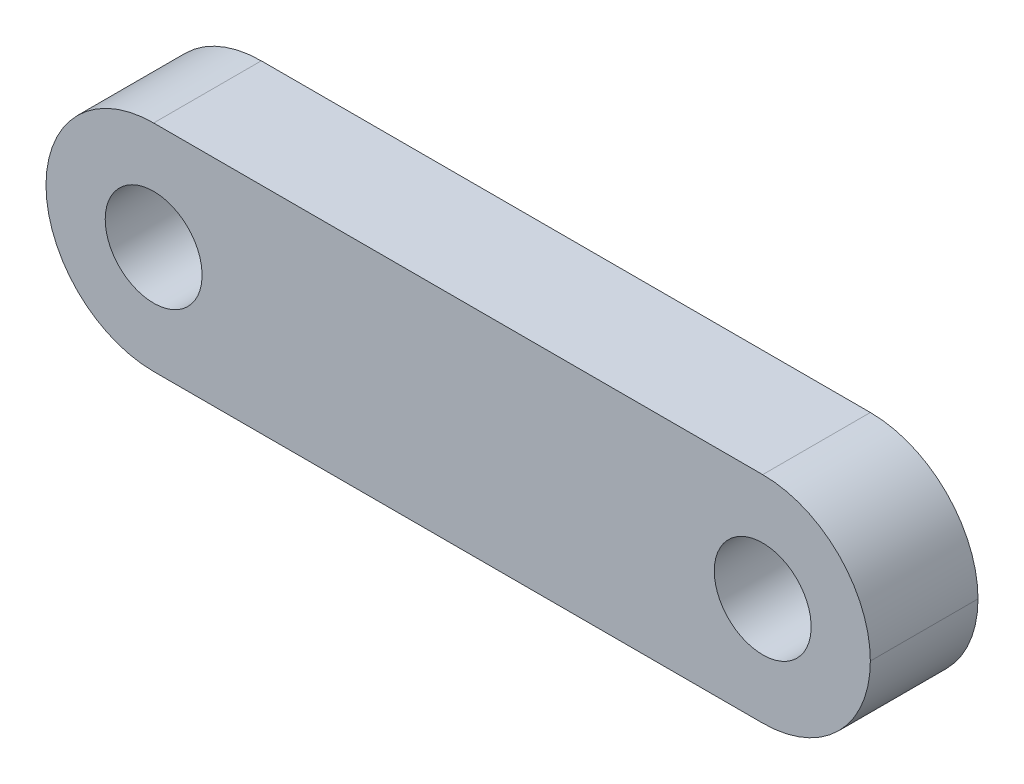
ISO-10303-21;
HEADER;
FILE_DESCRIPTION(('STEP AP214'),'2;1');
FILE_NAME('part.step','',(''),(''),'','','');
FILE_SCHEMA(('AUTOMOTIVE_DESIGN { 1 0 10303 214 1 1 1 1 }'));
ENDSEC;
DATA;
#1=APPLICATION_CONTEXT('core data for automotive mechanical design processes');
#2=APPLICATION_PROTOCOL_DEFINITION('international standard','automotive_design',2000,#1);
#3=PRODUCT_CONTEXT('',#1,'mechanical');
#4=PRODUCT('Part','Part','',(#3));
#5=PRODUCT_RELATED_PRODUCT_CATEGORY('part','',(#4));
#6=PRODUCT_DEFINITION_FORMATION('','',#4);
#7=PRODUCT_DEFINITION_CONTEXT('part definition',#1,'design');
#8=PRODUCT_DEFINITION('design','',#6,#7);
#9=PRODUCT_DEFINITION_SHAPE('','',#8);
#10=(LENGTH_UNIT() NAMED_UNIT(*) SI_UNIT(.MILLI.,.METRE.));
#11=(NAMED_UNIT(*) PLANE_ANGLE_UNIT() SI_UNIT($,.RADIAN.));
#12=(NAMED_UNIT(*) SI_UNIT($,.STERADIAN.) SOLID_ANGLE_UNIT());
#13=UNCERTAINTY_MEASURE_WITH_UNIT(LENGTH_MEASURE(1.E-05),#10,'distance_accuracy_value','');
#14=(GEOMETRIC_REPRESENTATION_CONTEXT(3) GLOBAL_UNCERTAINTY_ASSIGNED_CONTEXT((#13)) GLOBAL_UNIT_ASSIGNED_CONTEXT((#10,
#11,#12)) REPRESENTATION_CONTEXT('',''));
#15=CARTESIAN_POINT('',(0.,0.,0.));
#16=DIRECTION('',(0.,0.,1.));
#17=DIRECTION('',(1.,0.,0.));
#18=AXIS2_PLACEMENT_3D('',#15,#16,#17);
#19=CARTESIAN_POINT('',(-9.20014516444414,2.999,0.));
#20=DIRECTION('',(0.,0.,1.));
#21=DIRECTION('',(1.,0.,0.));
#22=AXIS2_PLACEMENT_3D('',#19,#20,#21);
#23=CYLINDRICAL_SURFACE('',#22,3.);
#24=CARTESIAN_POINT('',(-9.20014516444414,2.999,3.));
#25=DIRECTION('',(0.,0.,1.));
#26=DIRECTION('',(1.,0.,0.));
#27=AXIS2_PLACEMENT_3D('',#24,#25,#26);
#28=CIRCLE('',#27,3.);
#29=CARTESIAN_POINT('',(-9.20014516444414,5.999,3.));
#30=VERTEX_POINT('',#29);
#31=CARTESIAN_POINT('',(-12.2001451644441,2.999,3.));
#32=VERTEX_POINT('',#31);
#33=EDGE_CURVE('E122',#30,#32,#28,.T.);
#34=ORIENTED_EDGE('',*,*,#33,.F.);
#35=DIRECTION('',(0.,0.,1.));
#36=VECTOR('',#35,1.);
#37=CARTESIAN_POINT('',(-9.20014516444414,5.999,0.));
#38=LINE('',#37,#36);
#39=CARTESIAN_POINT('',(-9.20014516444414,5.999,0.));
#40=VERTEX_POINT('',#39);
#41=EDGE_CURVE('E11',#40,#30,#38,.T.);
#42=ORIENTED_EDGE('',*,*,#41,.F.);
#43=CARTESIAN_POINT('',(-9.20014516444414,2.999,0.));
#44=DIRECTION('',(0.,0.,1.));
#45=DIRECTION('',(1.,0.,0.));
#46=AXIS2_PLACEMENT_3D('',#43,#44,#45);
#47=CIRCLE('',#46,3.);
#48=CARTESIAN_POINT('',(-12.2001451644441,2.999,0.));
#49=VERTEX_POINT('',#48);
#50=EDGE_CURVE('E137',#40,#49,#47,.T.);
#51=ORIENTED_EDGE('',*,*,#50,.T.);
#52=DIRECTION('',(0.,0.,1.));
#53=VECTOR('',#52,1.);
#54=CARTESIAN_POINT('',(-12.2001451644441,2.999,0.));
#55=LINE('',#54,#53);
#56=EDGE_CURVE('E40',#49,#32,#55,.T.);
#57=ORIENTED_EDGE('',*,*,#56,.T.);
#58=EDGE_LOOP('',(#34,#42,#51,#57));
#59=FACE_BOUND('',#58,.T.);
#60=ADVANCED_FACE('F37',(#59),#23,.T.);
#61=CARTESIAN_POINT('',(7.7740879892329,5.999,0.));
#62=DIRECTION('',(0.,1.,0.));
#63=DIRECTION('',(0.,0.,1.));
#64=AXIS2_PLACEMENT_3D('',#61,#62,#63);
#65=PLANE('',#64);
#66=DIRECTION('',(-1.,0.,0.));
#67=VECTOR('',#66,1.);
#68=CARTESIAN_POINT('',(7.7740879892329,5.999,3.));
#69=LINE('',#68,#67);
#70=CARTESIAN_POINT('',(7.7740879892329,5.999,3.));
#71=VERTEX_POINT('',#70);
#72=EDGE_CURVE('E135',#71,#30,#69,.T.);
#73=ORIENTED_EDGE('',*,*,#72,.F.);
#74=DIRECTION('',(0.,0.,1.));
#75=VECTOR('',#74,1.);
#76=CARTESIAN_POINT('',(7.7740879892329,5.999,0.));
#77=LINE('',#76,#75);
#78=CARTESIAN_POINT('',(7.7740879892329,5.999,0.));
#79=VERTEX_POINT('',#78);
#80=EDGE_CURVE('E46',#79,#71,#77,.T.);
#81=ORIENTED_EDGE('',*,*,#80,.F.);
#82=DIRECTION('',(-1.,0.,0.));
#83=VECTOR('',#82,1.);
#84=CARTESIAN_POINT('',(7.7740879892329,5.999,0.));
#85=LINE('',#84,#83);
#86=EDGE_CURVE('E112',#79,#40,#85,.T.);
#87=ORIENTED_EDGE('',*,*,#86,.T.);
#88=ORIENTED_EDGE('',*,*,#41,.T.);
#89=EDGE_LOOP('',(#73,#81,#87,#88));
#90=FACE_BOUND('',#89,.T.);
#91=ADVANCED_FACE('F145',(#90),#65,.T.);
#92=CARTESIAN_POINT('',(7.7740879892329,2.999,0.));
#93=DIRECTION('',(0.,0.,1.));
#94=DIRECTION('',(1.,0.,0.));
#95=AXIS2_PLACEMENT_3D('',#92,#93,#94);
#96=CYLINDRICAL_SURFACE('',#95,3.);
#97=CARTESIAN_POINT('',(7.7740879892329,2.999,3.));
#98=DIRECTION('',(0.,0.,1.));
#99=DIRECTION('',(1.,0.,0.));
#100=AXIS2_PLACEMENT_3D('',#97,#98,#99);
#101=CIRCLE('',#100,3.);
#102=CARTESIAN_POINT('',(10.7740878225662,3.,3.));
#103=VERTEX_POINT('',#102);
#104=EDGE_CURVE('E99',#103,#71,#101,.T.);
#105=ORIENTED_EDGE('',*,*,#104,.F.);
#106=DIRECTION('',(0.,0.,1.));
#107=VECTOR('',#106,1.);
#108=CARTESIAN_POINT('',(10.7740878225662,3.,0.));
#109=LINE('',#108,#107);
#110=CARTESIAN_POINT('',(10.7740878225662,3.,0.));
#111=VERTEX_POINT('',#110);
#112=EDGE_CURVE('E94',#111,#103,#109,.T.);
#113=ORIENTED_EDGE('',*,*,#112,.F.);
#114=CARTESIAN_POINT('',(7.7740879892329,2.999,0.));
#115=DIRECTION('',(0.,0.,1.));
#116=DIRECTION('',(1.,0.,0.));
#117=AXIS2_PLACEMENT_3D('',#114,#115,#116);
#118=CIRCLE('',#117,3.);
#119=EDGE_CURVE('E97',#111,#79,#118,.T.);
#120=ORIENTED_EDGE('',*,*,#119,.T.);
#121=ORIENTED_EDGE('',*,*,#80,.T.);
#122=EDGE_LOOP('',(#105,#113,#120,#121));
#123=FACE_BOUND('',#122,.T.);
#124=ADVANCED_FACE('F96',(#123),#96,.T.);
#125=CARTESIAN_POINT('',(7.77408782256623,3.,0.));
#126=DIRECTION('',(0.,0.,1.));
#127=DIRECTION('',(1.,0.,0.));
#128=AXIS2_PLACEMENT_3D('',#125,#126,#127);
#129=CYLINDRICAL_SURFACE('',#128,2.99999999999999);
#130=CARTESIAN_POINT('',(7.77408782256623,3.,3.));
#131=DIRECTION('',(0.,0.,1.));
#132=DIRECTION('',(1.,0.,0.));
#133=AXIS2_PLACEMENT_3D('',#130,#131,#132);
#134=CIRCLE('',#133,2.99999999999999);
#135=CARTESIAN_POINT('',(7.77408782256623,0.,3.));
#136=VERTEX_POINT('',#135);
#137=EDGE_CURVE('E132',#136,#103,#134,.T.);
#138=ORIENTED_EDGE('',*,*,#137,.F.);
#139=DIRECTION('',(0.,0.,1.));
#140=VECTOR('',#139,1.);
#141=CARTESIAN_POINT('',(7.77408782256623,0.,0.));
#142=LINE('',#141,#140);
#143=CARTESIAN_POINT('',(7.77408782256623,0.,0.));
#144=VERTEX_POINT('',#143);
#145=EDGE_CURVE('E104',#144,#136,#142,.T.);
#146=ORIENTED_EDGE('',*,*,#145,.F.);
#147=CARTESIAN_POINT('',(7.77408782256623,3.,0.));
#148=DIRECTION('',(0.,0.,1.));
#149=DIRECTION('',(1.,0.,0.));
#150=AXIS2_PLACEMENT_3D('',#147,#148,#149);
#151=CIRCLE('',#150,2.99999999999999);
#152=EDGE_CURVE('E110',#144,#111,#151,.T.);
#153=ORIENTED_EDGE('',*,*,#152,.T.);
#154=ORIENTED_EDGE('',*,*,#112,.T.);
#155=EDGE_LOOP('',(#138,#146,#153,#154));
#156=FACE_BOUND('',#155,.T.);
#157=ADVANCED_FACE('F114',(#156),#129,.T.);
#158=CARTESIAN_POINT('',(-9.20014533111081,0.,0.));
#159=DIRECTION('',(0.,-1.,0.));
#160=DIRECTION('',(0.,0.,-1.));
#161=AXIS2_PLACEMENT_3D('',#158,#159,#160);
#162=PLANE('',#161);
#163=DIRECTION('',(1.,0.,0.));
#164=VECTOR('',#163,1.);
#165=CARTESIAN_POINT('',(-9.20014533111081,0.,3.));
#166=LINE('',#165,#164);
#167=CARTESIAN_POINT('',(-9.20014533111081,0.,3.));
#168=VERTEX_POINT('',#167);
#169=EDGE_CURVE('E129',#168,#136,#166,.T.);
#170=ORIENTED_EDGE('',*,*,#169,.F.);
#171=DIRECTION('',(0.,0.,1.));
#172=VECTOR('',#171,1.);
#173=CARTESIAN_POINT('',(-9.20014533111081,0.,0.));
#174=LINE('',#173,#172);
#175=CARTESIAN_POINT('',(-9.20014533111081,0.,0.));
#176=VERTEX_POINT('',#175);
#177=EDGE_CURVE('E140',#176,#168,#174,.T.);
#178=ORIENTED_EDGE('',*,*,#177,.F.);
#179=DIRECTION('',(1.,0.,0.));
#180=VECTOR('',#179,1.);
#181=CARTESIAN_POINT('',(-9.20014533111081,0.,0.));
#182=LINE('',#181,#180);
#183=EDGE_CURVE('E115',#176,#144,#182,.T.);
#184=ORIENTED_EDGE('',*,*,#183,.T.);
#185=ORIENTED_EDGE('',*,*,#145,.T.);
#186=EDGE_LOOP('',(#170,#178,#184,#185));
#187=FACE_BOUND('',#186,.T.);
#188=ADVANCED_FACE('F158',(#187),#162,.T.);
#189=CARTESIAN_POINT('',(-9.20014533111081,3.,0.));
#190=DIRECTION('',(0.,0.,1.));
#191=DIRECTION('',(1.,0.,0.));
#192=AXIS2_PLACEMENT_3D('',#189,#190,#191);
#193=CYLINDRICAL_SURFACE('',#192,3.);
#194=CARTESIAN_POINT('',(-9.20014533111081,3.,3.));
#195=DIRECTION('',(0.,0.,1.));
#196=DIRECTION('',(1.,0.,0.));
#197=AXIS2_PLACEMENT_3D('',#194,#195,#196);
#198=CIRCLE('',#197,3.);
#199=EDGE_CURVE('E125',#32,#168,#198,.T.);
#200=ORIENTED_EDGE('',*,*,#199,.F.);
#201=ORIENTED_EDGE('',*,*,#56,.F.);
#202=CARTESIAN_POINT('',(-9.20014533111081,3.,0.));
#203=DIRECTION('',(0.,0.,1.));
#204=DIRECTION('',(1.,0.,0.));
#205=AXIS2_PLACEMENT_3D('',#202,#203,#204);
#206=CIRCLE('',#205,3.);
#207=EDGE_CURVE('E117',#49,#176,#206,.T.);
#208=ORIENTED_EDGE('',*,*,#207,.T.);
#209=ORIENTED_EDGE('',*,*,#177,.T.);
#210=EDGE_LOOP('',(#200,#201,#208,#209));
#211=FACE_BOUND('',#210,.T.);
#212=ADVANCED_FACE('F142',(#211),#193,.T.);
#213=CARTESIAN_POINT('',(-9.20014516444414,2.999,0.));
#214=DIRECTION('',(0.,0.,1.));
#215=DIRECTION('',(1.,0.,0.));
#216=AXIS2_PLACEMENT_3D('',#213,#214,#215);
#217=PLANE('',#216);
#218=CARTESIAN_POINT('',(7.77408782256623,3.,0.));
#219=DIRECTION('',(0.,0.,1.));
#220=DIRECTION('',(-1.,0.,0.));
#221=AXIS2_PLACEMENT_3D('',#218,#219,#220);
#222=CIRCLE('',#221,1.35);
#223=CARTESIAN_POINT('',(6.42408782256623,3.,0.));
#224=VERTEX_POINT('',#223);
#225=EDGE_CURVE('E184',#224,#224,#222,.T.);
#226=ORIENTED_EDGE('',*,*,#225,.T.);
#227=EDGE_LOOP('',(#226));
#228=FACE_BOUND('',#227,.T.);
#229=CARTESIAN_POINT('',(-9.20014533111081,3.,0.));
#230=DIRECTION('',(0.,0.,1.));
#231=DIRECTION('',(-1.,0.,0.));
#232=AXIS2_PLACEMENT_3D('',#229,#230,#231);
#233=CIRCLE('',#232,1.35);
#234=CARTESIAN_POINT('',(-10.5501453311108,3.,0.));
#235=VERTEX_POINT('',#234);
#236=EDGE_CURVE('E126',#235,#235,#233,.T.);
#237=ORIENTED_EDGE('',*,*,#236,.T.);
#238=EDGE_LOOP('',(#237));
#239=FACE_BOUND('',#238,.T.);
#240=ORIENTED_EDGE('',*,*,#50,.F.);
#241=ORIENTED_EDGE('',*,*,#86,.F.);
#242=ORIENTED_EDGE('',*,*,#119,.F.);
#243=ORIENTED_EDGE('',*,*,#152,.F.);
#244=ORIENTED_EDGE('',*,*,#183,.F.);
#245=ORIENTED_EDGE('',*,*,#207,.F.);
#246=EDGE_LOOP('',(#240,#241,#242,#243,#244,#245));
#247=FACE_BOUND('',#246,.T.);
#248=ADVANCED_FACE('F108',(#228,#239,#247),#217,.F.);
#249=CARTESIAN_POINT('',(-9.20014516444414,2.999,3.));
#250=DIRECTION('',(0.,0.,1.));
#251=DIRECTION('',(1.,0.,0.));
#252=AXIS2_PLACEMENT_3D('',#249,#250,#251);
#253=PLANE('',#252);
#254=CARTESIAN_POINT('',(7.77408782256623,3.,3.));
#255=DIRECTION('',(0.,0.,1.));
#256=DIRECTION('',(-1.,0.,0.));
#257=AXIS2_PLACEMENT_3D('',#254,#255,#256);
#258=CIRCLE('',#257,1.35);
#259=CARTESIAN_POINT('',(6.42408782256623,3.,3.));
#260=VERTEX_POINT('',#259);
#261=EDGE_CURVE('E187',#260,#260,#258,.T.);
#262=ORIENTED_EDGE('',*,*,#261,.F.);
#263=EDGE_LOOP('',(#262));
#264=FACE_BOUND('',#263,.T.);
#265=CARTESIAN_POINT('',(-9.20014533111081,3.,3.));
#266=DIRECTION('',(0.,0.,1.));
#267=DIRECTION('',(-1.,0.,0.));
#268=AXIS2_PLACEMENT_3D('',#265,#266,#267);
#269=CIRCLE('',#268,1.35);
#270=CARTESIAN_POINT('',(-10.5501453311108,3.,3.));
#271=VERTEX_POINT('',#270);
#272=EDGE_CURVE('E189',#271,#271,#269,.T.);
#273=ORIENTED_EDGE('',*,*,#272,.F.);
#274=EDGE_LOOP('',(#273));
#275=FACE_BOUND('',#274,.T.);
#276=ORIENTED_EDGE('',*,*,#33,.T.);
#277=ORIENTED_EDGE('',*,*,#199,.T.);
#278=ORIENTED_EDGE('',*,*,#169,.T.);
#279=ORIENTED_EDGE('',*,*,#137,.T.);
#280=ORIENTED_EDGE('',*,*,#104,.T.);
#281=ORIENTED_EDGE('',*,*,#72,.T.);
#282=EDGE_LOOP('',(#276,#277,#278,#279,#280,#281));
#283=FACE_BOUND('',#282,.T.);
#284=ADVANCED_FACE('F144',(#264,#275,#283),#253,.T.);
#285=CARTESIAN_POINT('',(-9.20014533111081,3.,0.));
#286=DIRECTION('',(0.,0.,1.));
#287=DIRECTION('',(1.,0.,0.));
#288=AXIS2_PLACEMENT_3D('',#285,#286,#287);
#289=CYLINDRICAL_SURFACE('',#288,1.35);
#290=ORIENTED_EDGE('',*,*,#236,.F.);
#291=EDGE_LOOP('',(#290));
#292=FACE_BOUND('',#291,.T.);
#293=ORIENTED_EDGE('',*,*,#272,.T.);
#294=EDGE_LOOP('',(#293));
#295=FACE_BOUND('',#294,.T.);
#296=ADVANCED_FACE('F169',(#292,#295),#289,.F.);
#297=CARTESIAN_POINT('',(7.77408782256623,3.,0.));
#298=DIRECTION('',(0.,0.,1.));
#299=DIRECTION('',(1.,0.,0.));
#300=AXIS2_PLACEMENT_3D('',#297,#298,#299);
#301=CYLINDRICAL_SURFACE('',#300,1.35);
#302=ORIENTED_EDGE('',*,*,#225,.F.);
#303=EDGE_LOOP('',(#302));
#304=FACE_BOUND('',#303,.T.);
#305=ORIENTED_EDGE('',*,*,#261,.T.);
#306=EDGE_LOOP('',(#305));
#307=FACE_BOUND('',#306,.T.);
#308=ADVANCED_FACE('F176',(#304,#307),#301,.F.);
#309=CLOSED_SHELL('',(#60,#91,#124,#157,#188,#212,#248,#284,#296,#308));
#310=MANIFOLD_SOLID_BREP('B2',#309);
#311=ADVANCED_BREP_SHAPE_REPRESENTATION('',(#18,#310),#14);
#312=SHAPE_DEFINITION_REPRESENTATION(#9,#311);
ENDSEC;
END-ISO-10303-21;
